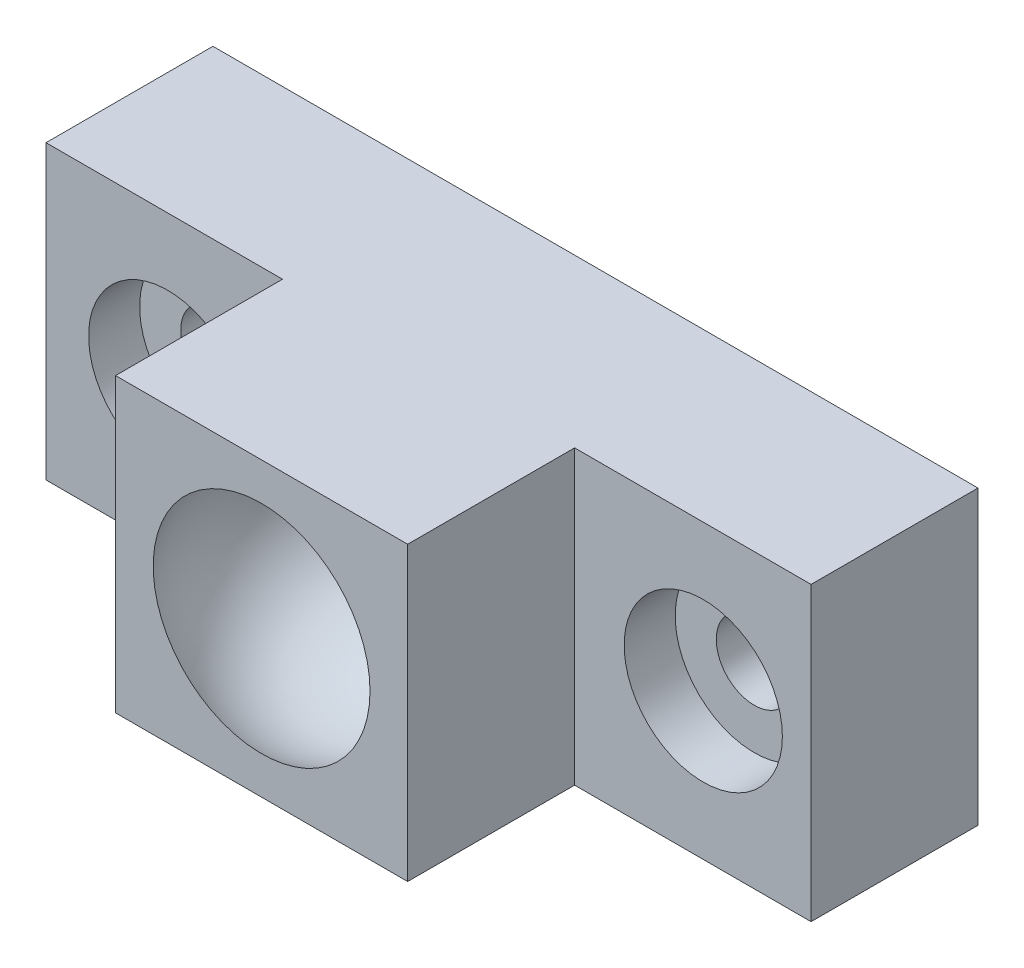
ISO-10303-21;
HEADER;
FILE_DESCRIPTION(('STEP AP214'),'2;1');
FILE_NAME('part.step','',(''),(''),'','','');
FILE_SCHEMA(('AUTOMOTIVE_DESIGN { 1 0 10303 214 1 1 1 1 }'));
ENDSEC;
DATA;
#1=APPLICATION_CONTEXT('core data for automotive mechanical design processes');
#2=APPLICATION_PROTOCOL_DEFINITION('international standard','automotive_design',2000,#1);
#3=PRODUCT_CONTEXT('',#1,'mechanical');
#4=PRODUCT('Part','Part','',(#3));
#5=PRODUCT_RELATED_PRODUCT_CATEGORY('part','',(#4));
#6=PRODUCT_DEFINITION_FORMATION('','',#4);
#7=PRODUCT_DEFINITION_CONTEXT('part definition',#1,'design');
#8=PRODUCT_DEFINITION('design','',#6,#7);
#9=PRODUCT_DEFINITION_SHAPE('','',#8);
#10=(LENGTH_UNIT() NAMED_UNIT(*) SI_UNIT(.MILLI.,.METRE.));
#11=(NAMED_UNIT(*) PLANE_ANGLE_UNIT() SI_UNIT($,.RADIAN.));
#12=(NAMED_UNIT(*) SI_UNIT($,.STERADIAN.) SOLID_ANGLE_UNIT());
#13=UNCERTAINTY_MEASURE_WITH_UNIT(LENGTH_MEASURE(1.E-05),#10,'distance_accuracy_value','');
#14=(GEOMETRIC_REPRESENTATION_CONTEXT(3) GLOBAL_UNCERTAINTY_ASSIGNED_CONTEXT((#13)) GLOBAL_UNIT_ASSIGNED_CONTEXT((#10,
#11,#12)) REPRESENTATION_CONTEXT('',''));
#15=CARTESIAN_POINT('',(0.,0.,0.));
#16=DIRECTION('',(0.,0.,1.));
#17=DIRECTION('',(1.,0.,0.));
#18=AXIS2_PLACEMENT_3D('',#15,#16,#17);
#19=CARTESIAN_POINT('',(1.81428571428573,-38.1,211.110505315495));
#20=DIRECTION('',(0.,1.,0.));
#21=DIRECTION('',(-1.,0.,0.));
#22=AXIS2_PLACEMENT_3D('',#19,#20,#21);
#23=PLANE('',#22);
#24=DIRECTION('',(0.,0.,1.));
#25=VECTOR('',#24,1.);
#26=CARTESIAN_POINT('',(88.9,-38.1,167.567648172638));
#27=LINE('',#26,#25);
#28=CARTESIAN_POINT('',(88.9,-38.1,167.567648172638));
#29=VERTEX_POINT('',#28);
#30=CARTESIAN_POINT('',(88.9,-38.1,211.110505315495));
#31=VERTEX_POINT('',#30);
#32=EDGE_CURVE('E164',#29,#31,#27,.T.);
#33=ORIENTED_EDGE('',*,*,#32,.T.);
#34=DIRECTION('',(1.,0.,0.));
#35=VECTOR('',#34,1.);
#36=CARTESIAN_POINT('',(1.81428571428573,-38.1,211.110505315495));
#37=LINE('',#36,#35);
#38=CARTESIAN_POINT('',(12.7,-38.1,211.110505315495));
#39=VERTEX_POINT('',#38);
#40=EDGE_CURVE('E53',#39,#31,#37,.T.);
#41=ORIENTED_EDGE('',*,*,#40,.F.);
#42=DIRECTION('',(0.,0.,1.));
#43=VECTOR('',#42,1.);
#44=CARTESIAN_POINT('',(12.7,-38.1,167.567648172638));
#45=LINE('',#44,#43);
#46=CARTESIAN_POINT('',(12.7,-38.1,167.567648172638));
#47=VERTEX_POINT('',#46);
#48=EDGE_CURVE('E69',#47,#39,#45,.T.);
#49=ORIENTED_EDGE('',*,*,#48,.F.);
#50=DIRECTION('',(1.,0.,0.));
#51=VECTOR('',#50,1.);
#52=CARTESIAN_POINT('',(12.7,-38.1,167.567648172638));
#53=LINE('',#52,#51);
#54=CARTESIAN_POINT('',(-48.9857142857143,-38.1,167.567648172638));
#55=VERTEX_POINT('',#54);
#56=EDGE_CURVE('E127',#55,#47,#53,.T.);
#57=ORIENTED_EDGE('',*,*,#56,.F.);
#58=DIRECTION('',(0.,0.,1.));
#59=VECTOR('',#58,1.);
#60=CARTESIAN_POINT('',(-48.9857142857143,-38.1,124.024791029781));
#61=LINE('',#60,#59);
#62=CARTESIAN_POINT('',(-48.9857142857143,-38.1,124.024791029781));
#63=VERTEX_POINT('',#62);
#64=EDGE_CURVE('E125',#63,#55,#61,.T.);
#65=ORIENTED_EDGE('',*,*,#64,.F.);
#66=DIRECTION('',(1.,0.,0.));
#67=VECTOR('',#66,1.);
#68=CARTESIAN_POINT('',(1.81428571428573,-38.1,124.024791029781));
#69=LINE('',#68,#67);
#70=CARTESIAN_POINT('',(150.585714285714,-38.1,124.024791029781));
#71=VERTEX_POINT('',#70);
#72=EDGE_CURVE('E112',#63,#71,#69,.T.);
#73=ORIENTED_EDGE('',*,*,#72,.T.);
#74=DIRECTION('',(0.,0.,-1.));
#75=VECTOR('',#74,1.);
#76=CARTESIAN_POINT('',(150.585714285714,-38.1,167.567648172638));
#77=LINE('',#76,#75);
#78=CARTESIAN_POINT('',(150.585714285714,-38.1,167.567648172638));
#79=VERTEX_POINT('',#78);
#80=EDGE_CURVE('E153',#79,#71,#77,.T.);
#81=ORIENTED_EDGE('',*,*,#80,.F.);
#82=DIRECTION('',(-1.,0.,0.));
#83=VECTOR('',#82,1.);
#84=CARTESIAN_POINT('',(88.9,-38.1,167.567648172638));
#85=LINE('',#84,#83);
#86=EDGE_CURVE('E160',#79,#29,#85,.T.);
#87=ORIENTED_EDGE('',*,*,#86,.T.);
#88=EDGE_LOOP('',(#33,#41,#49,#57,#65,#73,#81,#87));
#89=FACE_BOUND('',#88,.T.);
#90=ADVANCED_FACE('F45',(#89),#23,.F.);
#91=CARTESIAN_POINT('',(1.81428571428572,38.1,211.110505315495));
#92=DIRECTION('',(0.,-1.,0.));
#93=DIRECTION('',(0.,0.,-1.));
#94=AXIS2_PLACEMENT_3D('',#91,#92,#93);
#95=PLANE('',#94);
#96=DIRECTION('',(0.,0.,1.));
#97=VECTOR('',#96,1.);
#98=CARTESIAN_POINT('',(88.9,38.1,167.567648172638));
#99=LINE('',#98,#97);
#100=CARTESIAN_POINT('',(88.9,38.1,167.567648172638));
#101=VERTEX_POINT('',#100);
#102=CARTESIAN_POINT('',(88.9,38.1,211.110505315495));
#103=VERTEX_POINT('',#102);
#104=EDGE_CURVE('E61',#101,#103,#99,.T.);
#105=ORIENTED_EDGE('',*,*,#104,.F.);
#106=DIRECTION('',(1.,0.,0.));
#107=VECTOR('',#106,1.);
#108=CARTESIAN_POINT('',(99.7857142857143,38.1,167.567648172638));
#109=LINE('',#108,#107);
#110=CARTESIAN_POINT('',(150.585714285714,38.1,167.567648172638));
#111=VERTEX_POINT('',#110);
#112=EDGE_CURVE('E156',#101,#111,#109,.T.);
#113=ORIENTED_EDGE('',*,*,#112,.T.);
#114=DIRECTION('',(0.,0.,1.));
#115=VECTOR('',#114,1.);
#116=CARTESIAN_POINT('',(150.585714285714,38.1,124.024791029781));
#117=LINE('',#116,#115);
#118=CARTESIAN_POINT('',(150.585714285714,38.1,124.024791029781));
#119=VERTEX_POINT('',#118);
#120=EDGE_CURVE('E147',#119,#111,#117,.T.);
#121=ORIENTED_EDGE('',*,*,#120,.F.);
#122=DIRECTION('',(-1.,0.,0.));
#123=VECTOR('',#122,1.);
#124=CARTESIAN_POINT('',(1.81428571428572,38.1,124.024791029781));
#125=LINE('',#124,#123);
#126=CARTESIAN_POINT('',(-48.9857142857143,38.1,124.024791029781));
#127=VERTEX_POINT('',#126);
#128=EDGE_CURVE('E122',#119,#127,#125,.T.);
#129=ORIENTED_EDGE('',*,*,#128,.T.);
#130=DIRECTION('',(0.,0.,-1.));
#131=VECTOR('',#130,1.);
#132=CARTESIAN_POINT('',(-48.9857142857143,38.1,167.567648172638));
#133=LINE('',#132,#131);
#134=CARTESIAN_POINT('',(-48.9857142857143,38.1,167.567648172638));
#135=VERTEX_POINT('',#134);
#136=EDGE_CURVE('E136',#135,#127,#133,.T.);
#137=ORIENTED_EDGE('',*,*,#136,.F.);
#138=DIRECTION('',(-1.,0.,0.));
#139=VECTOR('',#138,1.);
#140=CARTESIAN_POINT('',(1.81428571428572,38.1,167.567648172638));
#141=LINE('',#140,#139);
#142=CARTESIAN_POINT('',(12.7,38.1,167.567648172638));
#143=VERTEX_POINT('',#142);
#144=EDGE_CURVE('E168',#143,#135,#141,.T.);
#145=ORIENTED_EDGE('',*,*,#144,.F.);
#146=DIRECTION('',(0.,0.,1.));
#147=VECTOR('',#146,1.);
#148=CARTESIAN_POINT('',(12.7,38.1,167.567648172638));
#149=LINE('',#148,#147);
#150=CARTESIAN_POINT('',(12.7,38.1,211.110505315495));
#151=VERTEX_POINT('',#150);
#152=EDGE_CURVE('E175',#143,#151,#149,.T.);
#153=ORIENTED_EDGE('',*,*,#152,.T.);
#154=DIRECTION('',(-1.,0.,0.));
#155=VECTOR('',#154,1.);
#156=CARTESIAN_POINT('',(1.81428571428572,38.1,211.110505315495));
#157=LINE('',#156,#155);
#158=EDGE_CURVE('E13',#103,#151,#157,.T.);
#159=ORIENTED_EDGE('',*,*,#158,.F.);
#160=EDGE_LOOP('',(#105,#113,#121,#129,#137,#145,#153,#159));
#161=FACE_BOUND('',#160,.T.);
#162=ADVANCED_FACE('F182',(#161),#95,.F.);
#163=CARTESIAN_POINT('',(39.9142857142857,0.,211.110505315495));
#164=DIRECTION('',(0.,0.,1.));
#165=DIRECTION('',(1.,0.,0.));
#166=AXIS2_PLACEMENT_3D('',#163,#164,#165);
#167=PLANE('',#166);
#168=CARTESIAN_POINT('',(50.8,0.,211.110505315495));
#169=DIRECTION('',(0.,0.,1.));
#170=DIRECTION('',(1.,0.,0.));
#171=AXIS2_PLACEMENT_3D('',#168,#169,#170);
#172=CIRCLE('',#171,28.2819153293032);
#173=CARTESIAN_POINT('',(79.0819153293033,0.,211.110505315495));
#174=VERTEX_POINT('',#173);
#175=EDGE_CURVE('E48',#174,#174,#172,.F.);
#176=ORIENTED_EDGE('',*,*,#175,.T.);
#177=EDGE_LOOP('',(#176));
#178=FACE_BOUND('',#177,.T.);
#179=ORIENTED_EDGE('',*,*,#40,.T.);
#180=DIRECTION('',(0.,1.,0.));
#181=VECTOR('',#180,1.);
#182=CARTESIAN_POINT('',(88.9,38.1,211.110505315495));
#183=LINE('',#182,#181);
#184=EDGE_CURVE('E155',#31,#103,#183,.T.);
#185=ORIENTED_EDGE('',*,*,#184,.T.);
#186=ORIENTED_EDGE('',*,*,#158,.T.);
#187=DIRECTION('',(0.,1.,0.));
#188=VECTOR('',#187,1.);
#189=CARTESIAN_POINT('',(12.7,38.1,211.110505315495));
#190=LINE('',#189,#188);
#191=EDGE_CURVE('E166',#39,#151,#190,.T.);
#192=ORIENTED_EDGE('',*,*,#191,.F.);
#193=EDGE_LOOP('',(#179,#185,#186,#192));
#194=FACE_BOUND('',#193,.T.);
#195=ADVANCED_FACE('F195',(#178,#194),#167,.T.);
#196=CARTESIAN_POINT('',(39.9142857142857,0.,124.024791029781));
#197=DIRECTION('',(0.,0.,1.));
#198=DIRECTION('',(1.,0.,0.));
#199=AXIS2_PLACEMENT_3D('',#196,#197,#198);
#200=PLANE('',#199);
#201=CARTESIAN_POINT('',(122.464285714286,0.,124.024791029781));
#202=DIRECTION('',(0.,0.,1.));
#203=DIRECTION('',(1.,0.,0.));
#204=AXIS2_PLACEMENT_3D('',#201,#202,#203);
#205=CIRCLE('',#204,9.92124);
#206=CARTESIAN_POINT('',(132.385525714286,0.,124.024791029781));
#207=VERTEX_POINT('',#206);
#208=EDGE_CURVE('E366',#207,#207,#205,.T.);
#209=ORIENTED_EDGE('',*,*,#208,.T.);
#210=EDGE_LOOP('',(#209));
#211=FACE_BOUND('',#210,.T.);
#212=CARTESIAN_POINT('',(-17.2357142857143,0.,124.024791029781));
#213=DIRECTION('',(0.,0.,1.));
#214=DIRECTION('',(1.,0.,0.));
#215=AXIS2_PLACEMENT_3D('',#212,#213,#214);
#216=CIRCLE('',#215,9.92123999999999);
#217=CARTESIAN_POINT('',(-7.31447428571428,0.,124.024791029781));
#218=VERTEX_POINT('',#217);
#219=EDGE_CURVE('E137',#218,#218,#216,.T.);
#220=ORIENTED_EDGE('',*,*,#219,.T.);
#221=EDGE_LOOP('',(#220));
#222=FACE_BOUND('',#221,.T.);
#223=ORIENTED_EDGE('',*,*,#72,.F.);
#224=DIRECTION('',(0.,-1.,0.));
#225=VECTOR('',#224,1.);
#226=CARTESIAN_POINT('',(-48.9857142857143,38.1,124.024791029781));
#227=LINE('',#226,#225);
#228=EDGE_CURVE('E116',#127,#63,#227,.T.);
#229=ORIENTED_EDGE('',*,*,#228,.F.);
#230=ORIENTED_EDGE('',*,*,#128,.F.);
#231=DIRECTION('',(0.,1.,0.));
#232=VECTOR('',#231,1.);
#233=CARTESIAN_POINT('',(150.585714285714,-38.1,124.024791029781));
#234=LINE('',#233,#232);
#235=EDGE_CURVE('E118',#71,#119,#234,.T.);
#236=ORIENTED_EDGE('',*,*,#235,.F.);
#237=EDGE_LOOP('',(#223,#229,#230,#236));
#238=FACE_BOUND('',#237,.T.);
#239=ADVANCED_FACE('F114',(#211,#222,#238),#200,.F.);
#240=CARTESIAN_POINT('',(50.8,0.,194.781933886924));
#241=DIRECTION('',(0.,1.,0.));
#242=DIRECTION('',(-1.,0.,0.));
#243=AXIS2_PLACEMENT_3D('',#240,#241,#242);
#244=SPHERICAL_SURFACE('',#243,32.6571428571429);
#245=CARTESIAN_POINT('',(50.8,0.,194.781933886924));
#246=DIRECTION('',(0.,0.,1.));
#247=DIRECTION('',(1.,0.,0.));
#248=AXIS2_PLACEMENT_3D('',#245,#246,#247);
#249=SPHERICAL_SURFACE('',#248,32.6571428571429);
#250=ORIENTED_EDGE('',*,*,#175,.F.);
#251=EDGE_LOOP('',(#250));
#252=FACE_BOUND('',#251,.T.);
#253=ADVANCED_FACE('F207',(#252),#249,.F.);
#254=CARTESIAN_POINT('',(12.7,38.1,167.567648172638));
#255=DIRECTION('',(1.,0.,0.));
#256=DIRECTION('',(0.,1.,0.));
#257=AXIS2_PLACEMENT_3D('',#254,#255,#256);
#258=PLANE('',#257);
#259=ORIENTED_EDGE('',*,*,#191,.T.);
#260=ORIENTED_EDGE('',*,*,#152,.F.);
#261=DIRECTION('',(0.,1.,0.));
#262=VECTOR('',#261,1.);
#263=CARTESIAN_POINT('',(12.7,38.1,167.567648172638));
#264=LINE('',#263,#262);
#265=EDGE_CURVE('E171',#47,#143,#264,.T.);
#266=ORIENTED_EDGE('',*,*,#265,.F.);
#267=ORIENTED_EDGE('',*,*,#48,.T.);
#268=EDGE_LOOP('',(#259,#260,#266,#267));
#269=FACE_BOUND('',#268,.T.);
#270=ADVANCED_FACE('F196',(#269),#258,.F.);
#271=CARTESIAN_POINT('',(39.9142857142857,0.,167.567648172638));
#272=DIRECTION('',(0.,0.,-1.));
#273=DIRECTION('',(-1.,0.,0.));
#274=AXIS2_PLACEMENT_3D('',#271,#272,#273);
#275=PLANE('',#274);
#276=CARTESIAN_POINT('',(-17.2357142857143,0.,167.567648172638));
#277=DIRECTION('',(0.,0.,1.));
#278=DIRECTION('',(1.,0.,0.));
#279=AXIS2_PLACEMENT_3D('',#276,#277,#278);
#280=CIRCLE('',#279,20.6375);
#281=CARTESIAN_POINT('',(3.40178571428573,0.,167.567648172638));
#282=VERTEX_POINT('',#281);
#283=EDGE_CURVE('E369',#282,#282,#280,.T.);
#284=ORIENTED_EDGE('',*,*,#283,.F.);
#285=EDGE_LOOP('',(#284));
#286=FACE_BOUND('',#285,.T.);
#287=ORIENTED_EDGE('',*,*,#144,.T.);
#288=DIRECTION('',(0.,1.,0.));
#289=VECTOR('',#288,1.);
#290=CARTESIAN_POINT('',(-48.9857142857143,-38.1,167.567648172638));
#291=LINE('',#290,#289);
#292=EDGE_CURVE('E131',#55,#135,#291,.T.);
#293=ORIENTED_EDGE('',*,*,#292,.F.);
#294=ORIENTED_EDGE('',*,*,#56,.T.);
#295=ORIENTED_EDGE('',*,*,#265,.T.);
#296=EDGE_LOOP('',(#287,#293,#294,#295));
#297=FACE_BOUND('',#296,.T.);
#298=ADVANCED_FACE('F198',(#286,#297),#275,.F.);
#299=CARTESIAN_POINT('',(88.9,38.1,167.567648172638));
#300=DIRECTION('',(1.,0.,0.));
#301=DIRECTION('',(0.,1.,0.));
#302=AXIS2_PLACEMENT_3D('',#299,#300,#301);
#303=PLANE('',#302);
#304=ORIENTED_EDGE('',*,*,#184,.F.);
#305=ORIENTED_EDGE('',*,*,#32,.F.);
#306=DIRECTION('',(0.,1.,0.));
#307=VECTOR('',#306,1.);
#308=CARTESIAN_POINT('',(88.9,38.1,167.567648172638));
#309=LINE('',#308,#307);
#310=EDGE_CURVE('E158',#29,#101,#309,.T.);
#311=ORIENTED_EDGE('',*,*,#310,.T.);
#312=ORIENTED_EDGE('',*,*,#104,.T.);
#313=EDGE_LOOP('',(#304,#305,#311,#312));
#314=FACE_BOUND('',#313,.T.);
#315=ADVANCED_FACE('F192',(#314),#303,.T.);
#316=CARTESIAN_POINT('',(61.6857142857143,0.,167.567648172638));
#317=DIRECTION('',(0.,0.,-1.));
#318=DIRECTION('',(1.,0.,0.));
#319=AXIS2_PLACEMENT_3D('',#316,#317,#318);
#320=PLANE('',#319);
#321=CARTESIAN_POINT('',(122.464285714286,0.,167.567648172638));
#322=DIRECTION('',(0.,0.,1.));
#323=DIRECTION('',(1.,0.,0.));
#324=AXIS2_PLACEMENT_3D('',#321,#322,#323);
#325=CIRCLE('',#324,20.6375);
#326=CARTESIAN_POINT('',(143.101785714286,0.,167.567648172638));
#327=VERTEX_POINT('',#326);
#328=EDGE_CURVE('E359',#327,#327,#325,.T.);
#329=ORIENTED_EDGE('',*,*,#328,.F.);
#330=EDGE_LOOP('',(#329));
#331=FACE_BOUND('',#330,.T.);
#332=ORIENTED_EDGE('',*,*,#112,.F.);
#333=ORIENTED_EDGE('',*,*,#310,.F.);
#334=ORIENTED_EDGE('',*,*,#86,.F.);
#335=DIRECTION('',(0.,-1.,0.));
#336=VECTOR('',#335,1.);
#337=CARTESIAN_POINT('',(150.585714285714,38.1,167.567648172638));
#338=LINE('',#337,#336);
#339=EDGE_CURVE('E150',#111,#79,#338,.T.);
#340=ORIENTED_EDGE('',*,*,#339,.F.);
#341=EDGE_LOOP('',(#332,#333,#334,#340));
#342=FACE_BOUND('',#341,.T.);
#343=ADVANCED_FACE('F191',(#331,#342),#320,.F.);
#344=CARTESIAN_POINT('',(150.585714285714,0.,0.));
#345=DIRECTION('',(1.,0.,0.));
#346=DIRECTION('',(0.,0.,-1.));
#347=AXIS2_PLACEMENT_3D('',#344,#345,#346);
#348=PLANE('',#347);
#349=ORIENTED_EDGE('',*,*,#235,.T.);
#350=ORIENTED_EDGE('',*,*,#120,.T.);
#351=ORIENTED_EDGE('',*,*,#339,.T.);
#352=ORIENTED_EDGE('',*,*,#80,.T.);
#353=EDGE_LOOP('',(#349,#350,#351,#352));
#354=FACE_BOUND('',#353,.T.);
#355=ADVANCED_FACE('F187',(#354),#348,.T.);
#356=CARTESIAN_POINT('',(-48.9857142857143,0.,0.));
#357=DIRECTION('',(-1.,0.,0.));
#358=DIRECTION('',(0.,-1.,0.));
#359=AXIS2_PLACEMENT_3D('',#356,#357,#358);
#360=PLANE('',#359);
#361=ORIENTED_EDGE('',*,*,#228,.T.);
#362=ORIENTED_EDGE('',*,*,#64,.T.);
#363=ORIENTED_EDGE('',*,*,#292,.T.);
#364=ORIENTED_EDGE('',*,*,#136,.T.);
#365=EDGE_LOOP('',(#361,#362,#363,#364));
#366=FACE_BOUND('',#365,.T.);
#367=ADVANCED_FACE('F134',(#366),#360,.T.);
#368=CARTESIAN_POINT('',(-17.2357142857143,0.,167.567648172638));
#369=DIRECTION('',(0.,0.,1.));
#370=DIRECTION('',(1.,0.,0.));
#371=AXIS2_PLACEMENT_3D('',#368,#369,#370);
#372=CYLINDRICAL_SURFACE('',#371,9.92123999999999);
#373=ORIENTED_EDGE('',*,*,#219,.F.);
#374=EDGE_LOOP('',(#373));
#375=FACE_BOUND('',#374,.T.);
#376=CARTESIAN_POINT('',(-17.2357142857143,0.,154.258048172638));
#377=DIRECTION('',(0.,0.,1.));
#378=DIRECTION('',(1.,0.,0.));
#379=AXIS2_PLACEMENT_3D('',#376,#377,#378);
#380=CIRCLE('',#379,9.92124);
#381=CARTESIAN_POINT('',(-7.31447428571428,0.,154.258048172638));
#382=VERTEX_POINT('',#381);
#383=EDGE_CURVE('E140',#382,#382,#380,.T.);
#384=ORIENTED_EDGE('',*,*,#383,.T.);
#385=EDGE_LOOP('',(#384));
#386=FACE_BOUND('',#385,.T.);
#387=ADVANCED_FACE('F274',(#375,#386),#372,.F.);
#388=CARTESIAN_POINT('',(-7.31447428571428,0.,154.258048172638));
#389=DIRECTION('',(0.,0.,-1.));
#390=DIRECTION('',(-1.,0.,0.));
#391=AXIS2_PLACEMENT_3D('',#388,#389,#390);
#392=PLANE('',#391);
#393=ORIENTED_EDGE('',*,*,#383,.F.);
#394=EDGE_LOOP('',(#393));
#395=FACE_BOUND('',#394,.T.);
#396=CARTESIAN_POINT('',(-17.2357142857143,0.,154.258048172638));
#397=DIRECTION('',(0.,0.,1.));
#398=DIRECTION('',(1.,0.,0.));
#399=AXIS2_PLACEMENT_3D('',#396,#397,#398);
#400=CIRCLE('',#399,20.6375);
#401=CARTESIAN_POINT('',(3.40178571428573,0.,154.258048172638));
#402=VERTEX_POINT('',#401);
#403=EDGE_CURVE('E372',#402,#402,#400,.T.);
#404=ORIENTED_EDGE('',*,*,#403,.T.);
#405=EDGE_LOOP('',(#404));
#406=FACE_BOUND('',#405,.T.);
#407=ADVANCED_FACE('F299',(#395,#406),#392,.F.);
#408=CARTESIAN_POINT('',(-17.2357142857143,0.,167.567648172638));
#409=DIRECTION('',(0.,0.,1.));
#410=DIRECTION('',(1.,0.,0.));
#411=AXIS2_PLACEMENT_3D('',#408,#409,#410);
#412=CYLINDRICAL_SURFACE('',#411,20.6375);
#413=ORIENTED_EDGE('',*,*,#403,.F.);
#414=EDGE_LOOP('',(#413));
#415=FACE_BOUND('',#414,.T.);
#416=ORIENTED_EDGE('',*,*,#283,.T.);
#417=EDGE_LOOP('',(#416));
#418=FACE_BOUND('',#417,.T.);
#419=ADVANCED_FACE('F309',(#415,#418),#412,.F.);
#420=CARTESIAN_POINT('',(122.464285714286,0.,167.567648172638));
#421=DIRECTION('',(0.,0.,1.));
#422=DIRECTION('',(1.,0.,0.));
#423=AXIS2_PLACEMENT_3D('',#420,#421,#422);
#424=CYLINDRICAL_SURFACE('',#423,9.92124);
#425=ORIENTED_EDGE('',*,*,#208,.F.);
#426=EDGE_LOOP('',(#425));
#427=FACE_BOUND('',#426,.T.);
#428=CARTESIAN_POINT('',(122.464285714286,0.,154.258048172638));
#429=DIRECTION('',(0.,0.,1.));
#430=DIRECTION('',(1.,0.,0.));
#431=AXIS2_PLACEMENT_3D('',#428,#429,#430);
#432=CIRCLE('',#431,9.92124);
#433=CARTESIAN_POINT('',(132.385525714286,0.,154.258048172638));
#434=VERTEX_POINT('',#433);
#435=EDGE_CURVE('E361',#434,#434,#432,.T.);
#436=ORIENTED_EDGE('',*,*,#435,.T.);
#437=EDGE_LOOP('',(#436));
#438=FACE_BOUND('',#437,.T.);
#439=ADVANCED_FACE('F319',(#427,#438),#424,.F.);
#440=CARTESIAN_POINT('',(132.385525714286,0.,154.258048172638));
#441=DIRECTION('',(0.,0.,-1.));
#442=DIRECTION('',(-1.,0.,0.));
#443=AXIS2_PLACEMENT_3D('',#440,#441,#442);
#444=PLANE('',#443);
#445=ORIENTED_EDGE('',*,*,#435,.F.);
#446=EDGE_LOOP('',(#445));
#447=FACE_BOUND('',#446,.T.);
#448=CARTESIAN_POINT('',(122.464285714286,0.,154.258048172638));
#449=DIRECTION('',(0.,0.,1.));
#450=DIRECTION('',(1.,0.,0.));
#451=AXIS2_PLACEMENT_3D('',#448,#449,#450);
#452=CIRCLE('',#451,20.6375);
#453=CARTESIAN_POINT('',(143.101785714286,0.,154.258048172638));
#454=VERTEX_POINT('',#453);
#455=EDGE_CURVE('E356',#454,#454,#452,.T.);
#456=ORIENTED_EDGE('',*,*,#455,.T.);
#457=EDGE_LOOP('',(#456));
#458=FACE_BOUND('',#457,.T.);
#459=ADVANCED_FACE('F329',(#447,#458),#444,.F.);
#460=CARTESIAN_POINT('',(122.464285714286,0.,167.567648172638));
#461=DIRECTION('',(0.,0.,1.));
#462=DIRECTION('',(1.,0.,0.));
#463=AXIS2_PLACEMENT_3D('',#460,#461,#462);
#464=CYLINDRICAL_SURFACE('',#463,20.6375);
#465=ORIENTED_EDGE('',*,*,#455,.F.);
#466=EDGE_LOOP('',(#465));
#467=FACE_BOUND('',#466,.T.);
#468=ORIENTED_EDGE('',*,*,#328,.T.);
#469=EDGE_LOOP('',(#468));
#470=FACE_BOUND('',#469,.T.);
#471=ADVANCED_FACE('F339',(#467,#470),#464,.F.);
#472=CLOSED_SHELL('',(#90,#162,#195,#239,#253,#270,#298,#315,#343,#355,#367,#387,#407,#419,#439,
#459,#471));
#473=MANIFOLD_SOLID_BREP('B2',#472);
#474=ADVANCED_BREP_SHAPE_REPRESENTATION('',(#18,#473),#14);
#475=SHAPE_DEFINITION_REPRESENTATION(#9,#474);
ENDSEC;
END-ISO-10303-21;
